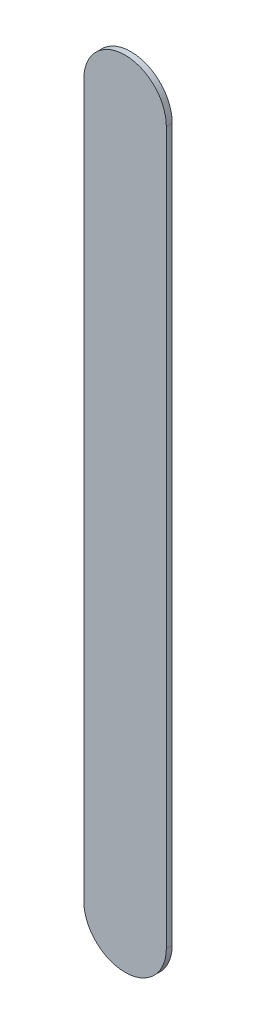
ISO-10303-21;
HEADER;
FILE_DESCRIPTION(('STEP AP214'),'2;1');
FILE_NAME('part.step','',(''),(''),'','','');
FILE_SCHEMA(('AUTOMOTIVE_DESIGN { 1 0 10303 214 1 1 1 1 }'));
ENDSEC;
DATA;
#1=APPLICATION_CONTEXT('core data for automotive mechanical design processes');
#2=APPLICATION_PROTOCOL_DEFINITION('international standard','automotive_design',2000,#1);
#3=PRODUCT_CONTEXT('',#1,'mechanical');
#4=PRODUCT('Part','Part','',(#3));
#5=PRODUCT_RELATED_PRODUCT_CATEGORY('part','',(#4));
#6=PRODUCT_DEFINITION_FORMATION('','',#4);
#7=PRODUCT_DEFINITION_CONTEXT('part definition',#1,'design');
#8=PRODUCT_DEFINITION('design','',#6,#7);
#9=PRODUCT_DEFINITION_SHAPE('','',#8);
#10=(LENGTH_UNIT() NAMED_UNIT(*) SI_UNIT(.MILLI.,.METRE.));
#11=(NAMED_UNIT(*) PLANE_ANGLE_UNIT() SI_UNIT($,.RADIAN.));
#12=(NAMED_UNIT(*) SI_UNIT($,.STERADIAN.) SOLID_ANGLE_UNIT());
#13=UNCERTAINTY_MEASURE_WITH_UNIT(LENGTH_MEASURE(1.E-05),#10,'distance_accuracy_value','');
#14=(GEOMETRIC_REPRESENTATION_CONTEXT(3) GLOBAL_UNCERTAINTY_ASSIGNED_CONTEXT((#13)) GLOBAL_UNIT_ASSIGNED_CONTEXT((#10,
#11,#12)) REPRESENTATION_CONTEXT('',''));
#15=CARTESIAN_POINT('',(0.,0.,0.));
#16=DIRECTION('',(0.,0.,1.));
#17=DIRECTION('',(1.,0.,0.));
#18=AXIS2_PLACEMENT_3D('',#15,#16,#17);
#19=CARTESIAN_POINT('',(49.61500364,93.64858842,0.));
#20=DIRECTION('',(-1.,0.,0.));
#21=DIRECTION('',(0.,1.,0.));
#22=AXIS2_PLACEMENT_3D('',#19,#20,#21);
#23=PLANE('',#22);
#24=DIRECTION('',(0.,1.,0.));
#25=VECTOR('',#24,1.);
#26=CARTESIAN_POINT('',(49.61500364,93.64858842,0.03556));
#27=LINE('',#26,#25);
#28=CARTESIAN_POINT('',(49.61500364,93.64858842,0.03556));
#29=VERTEX_POINT('',#28);
#30=CARTESIAN_POINT('',(49.61500364,97.96201134,0.03556));
#31=VERTEX_POINT('',#30);
#32=EDGE_CURVE('E11',#29,#31,#27,.T.);
#33=ORIENTED_EDGE('',*,*,#32,.F.);
#34=DIRECTION('',(0.,0.,1.));
#35=VECTOR('',#34,1.);
#36=CARTESIAN_POINT('',(49.61500364,93.64858842,0.));
#37=LINE('',#36,#35);
#38=CARTESIAN_POINT('',(49.61500364,93.64858842,0.));
#39=VERTEX_POINT('',#38);
#40=EDGE_CURVE('E24',#39,#29,#37,.T.);
#41=ORIENTED_EDGE('',*,*,#40,.F.);
#42=DIRECTION('',(0.,1.,0.));
#43=VECTOR('',#42,1.);
#44=CARTESIAN_POINT('',(49.61500364,93.64858842,0.));
#45=LINE('',#44,#43);
#46=CARTESIAN_POINT('',(49.61500364,97.96201134,0.));
#47=VERTEX_POINT('',#46);
#48=EDGE_CURVE('E75',#39,#47,#45,.T.);
#49=ORIENTED_EDGE('',*,*,#48,.T.);
#50=DIRECTION('',(0.,0.,1.));
#51=VECTOR('',#50,1.);
#52=CARTESIAN_POINT('',(49.61500364,97.96201134,0.));
#53=LINE('',#52,#51);
#54=EDGE_CURVE('E37',#47,#31,#53,.T.);
#55=ORIENTED_EDGE('',*,*,#54,.T.);
#56=EDGE_LOOP('',(#33,#41,#49,#55));
#57=FACE_BOUND('',#56,.T.);
#58=ADVANCED_FACE('F17',(#57),#23,.F.);
#59=CARTESIAN_POINT('',(49.36500414,97.96201134,0.));
#60=DIRECTION('',(0.,0.,-1.));
#61=DIRECTION('',(1.,0.,0.));
#62=AXIS2_PLACEMENT_3D('',#59,#60,#61);
#63=CYLINDRICAL_SURFACE('',#62,0.249999499999999);
#64=CARTESIAN_POINT('',(49.36500414,97.96201134,0.03556));
#65=DIRECTION('',(0.,0.,1.));
#66=DIRECTION('',(1.,0.,0.));
#67=AXIS2_PLACEMENT_3D('',#64,#65,#66);
#68=CIRCLE('',#67,0.249999499999999);
#69=CARTESIAN_POINT('',(49.11500464,97.96201134,0.03556));
#70=VERTEX_POINT('',#69);
#71=EDGE_CURVE('E83',#31,#70,#68,.T.);
#72=ORIENTED_EDGE('',*,*,#71,.F.);
#73=ORIENTED_EDGE('',*,*,#54,.F.);
#74=CARTESIAN_POINT('',(49.36500414,97.96201134,0.));
#75=DIRECTION('',(0.,0.,1.));
#76=DIRECTION('',(1.,0.,0.));
#77=AXIS2_PLACEMENT_3D('',#74,#75,#76);
#78=CIRCLE('',#77,0.249999499999999);
#79=CARTESIAN_POINT('',(49.11500464,97.96201134,0.));
#80=VERTEX_POINT('',#79);
#81=EDGE_CURVE('E81',#47,#80,#78,.T.);
#82=ORIENTED_EDGE('',*,*,#81,.T.);
#83=DIRECTION('',(0.,0.,1.));
#84=VECTOR('',#83,1.);
#85=CARTESIAN_POINT('',(49.11500464,97.96201134,0.));
#86=LINE('',#85,#84);
#87=EDGE_CURVE('E67',#80,#70,#86,.T.);
#88=ORIENTED_EDGE('',*,*,#87,.T.);
#89=EDGE_LOOP('',(#72,#73,#82,#88));
#90=FACE_BOUND('',#89,.T.);
#91=ADVANCED_FACE('F89',(#90),#63,.T.);
#92=CARTESIAN_POINT('',(49.11500464,97.96201134,0.));
#93=DIRECTION('',(1.,0.,0.));
#94=DIRECTION('',(0.,-1.,0.));
#95=AXIS2_PLACEMENT_3D('',#92,#93,#94);
#96=PLANE('',#95);
#97=DIRECTION('',(0.,-1.,0.));
#98=VECTOR('',#97,1.);
#99=CARTESIAN_POINT('',(49.11500464,97.96201134,0.03556));
#100=LINE('',#99,#98);
#101=CARTESIAN_POINT('',(49.11500464,93.64858842,0.03556));
#102=VERTEX_POINT('',#101);
#103=EDGE_CURVE('E71',#70,#102,#100,.T.);
#104=ORIENTED_EDGE('',*,*,#103,.F.);
#105=ORIENTED_EDGE('',*,*,#87,.F.);
#106=DIRECTION('',(0.,-1.,0.));
#107=VECTOR('',#106,1.);
#108=CARTESIAN_POINT('',(49.11500464,97.96201134,0.));
#109=LINE('',#108,#107);
#110=CARTESIAN_POINT('',(49.11500464,93.64858842,0.));
#111=VERTEX_POINT('',#110);
#112=EDGE_CURVE('E63',#80,#111,#109,.T.);
#113=ORIENTED_EDGE('',*,*,#112,.T.);
#114=DIRECTION('',(0.,0.,1.));
#115=VECTOR('',#114,1.);
#116=CARTESIAN_POINT('',(49.11500464,93.64858842,0.));
#117=LINE('',#116,#115);
#118=EDGE_CURVE('E53',#111,#102,#117,.T.);
#119=ORIENTED_EDGE('',*,*,#118,.T.);
#120=EDGE_LOOP('',(#104,#105,#113,#119));
#121=FACE_BOUND('',#120,.T.);
#122=ADVANCED_FACE('F66',(#121),#96,.F.);
#123=CARTESIAN_POINT('',(49.36500414,93.64858842,0.));
#124=DIRECTION('',(0.,0.,-1.));
#125=DIRECTION('',(-1.,0.,0.));
#126=AXIS2_PLACEMENT_3D('',#123,#124,#125);
#127=CYLINDRICAL_SURFACE('',#126,0.249999499999999);
#128=CARTESIAN_POINT('',(49.36500414,93.64858842,0.03556));
#129=DIRECTION('',(0.,0.,1.));
#130=DIRECTION('',(-1.,0.,0.));
#131=AXIS2_PLACEMENT_3D('',#128,#129,#130);
#132=CIRCLE('',#131,0.249999499999999);
#133=EDGE_CURVE('E59',#102,#29,#132,.T.);
#134=ORIENTED_EDGE('',*,*,#133,.F.);
#135=ORIENTED_EDGE('',*,*,#118,.F.);
#136=CARTESIAN_POINT('',(49.36500414,93.64858842,0.));
#137=DIRECTION('',(0.,0.,1.));
#138=DIRECTION('',(-1.,0.,0.));
#139=AXIS2_PLACEMENT_3D('',#136,#137,#138);
#140=CIRCLE('',#139,0.249999499999999);
#141=EDGE_CURVE('E57',#111,#39,#140,.T.);
#142=ORIENTED_EDGE('',*,*,#141,.T.);
#143=ORIENTED_EDGE('',*,*,#40,.T.);
#144=EDGE_LOOP('',(#134,#135,#142,#143));
#145=FACE_BOUND('',#144,.T.);
#146=ADVANCED_FACE('F55',(#145),#127,.T.);
#147=CARTESIAN_POINT('',(49.61500364,93.64858842,0.));
#148=DIRECTION('',(0.,0.,-1.));
#149=DIRECTION('',(-1.,0.,0.));
#150=AXIS2_PLACEMENT_3D('',#147,#148,#149);
#151=PLANE('',#150);
#152=ORIENTED_EDGE('',*,*,#141,.F.);
#153=ORIENTED_EDGE('',*,*,#112,.F.);
#154=ORIENTED_EDGE('',*,*,#81,.F.);
#155=ORIENTED_EDGE('',*,*,#48,.F.);
#156=EDGE_LOOP('',(#152,#153,#154,#155));
#157=FACE_BOUND('',#156,.T.);
#158=ADVANCED_FACE('F74',(#157),#151,.T.);
#159=CARTESIAN_POINT('',(49.61500364,93.64858842,0.03556));
#160=DIRECTION('',(0.,0.,-1.));
#161=DIRECTION('',(-1.,0.,0.));
#162=AXIS2_PLACEMENT_3D('',#159,#160,#161);
#163=PLANE('',#162);
#164=ORIENTED_EDGE('',*,*,#32,.T.);
#165=ORIENTED_EDGE('',*,*,#71,.T.);
#166=ORIENTED_EDGE('',*,*,#103,.T.);
#167=ORIENTED_EDGE('',*,*,#133,.T.);
#168=EDGE_LOOP('',(#164,#165,#166,#167));
#169=FACE_BOUND('',#168,.T.);
#170=ADVANCED_FACE('F91',(#169),#163,.F.);
#171=CLOSED_SHELL('',(#58,#91,#122,#146,#158,#170));
#172=MANIFOLD_SOLID_BREP('B1',#171);
#173=ADVANCED_BREP_SHAPE_REPRESENTATION('',(#18,#172),#14);
#174=SHAPE_DEFINITION_REPRESENTATION(#9,#173);
ENDSEC;
END-ISO-10303-21;
